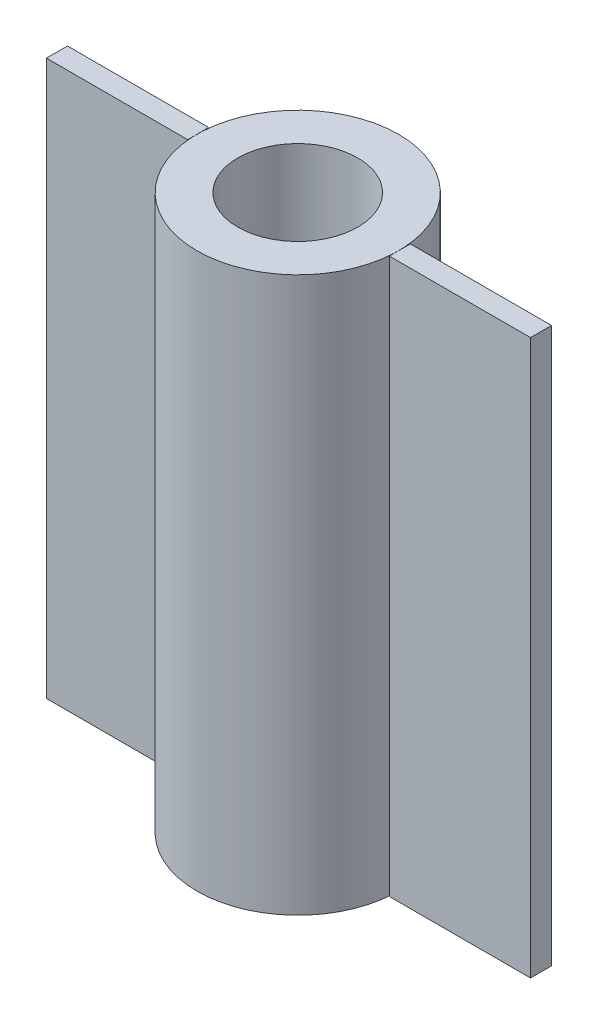
ISO-10303-21;
HEADER;
FILE_DESCRIPTION(('STEP AP214'),'2;1');
FILE_NAME('part.step','',(''),(''),'','','');
FILE_SCHEMA(('AUTOMOTIVE_DESIGN { 1 0 10303 214 1 1 1 1 }'));
ENDSEC;
DATA;
#1=APPLICATION_CONTEXT('core data for automotive mechanical design processes');
#2=APPLICATION_PROTOCOL_DEFINITION('international standard','automotive_design',2000,#1);
#3=PRODUCT_CONTEXT('',#1,'mechanical');
#4=PRODUCT('Part','Part','',(#3));
#5=PRODUCT_RELATED_PRODUCT_CATEGORY('part','',(#4));
#6=PRODUCT_DEFINITION_FORMATION('','',#4);
#7=PRODUCT_DEFINITION_CONTEXT('part definition',#1,'design');
#8=PRODUCT_DEFINITION('design','',#6,#7);
#9=PRODUCT_DEFINITION_SHAPE('','',#8);
#10=(LENGTH_UNIT() NAMED_UNIT(*) SI_UNIT(.MILLI.,.METRE.));
#11=(NAMED_UNIT(*) PLANE_ANGLE_UNIT() SI_UNIT($,.RADIAN.));
#12=(NAMED_UNIT(*) SI_UNIT($,.STERADIAN.) SOLID_ANGLE_UNIT());
#13=UNCERTAINTY_MEASURE_WITH_UNIT(LENGTH_MEASURE(1.E-05),#10,'distance_accuracy_value','');
#14=(GEOMETRIC_REPRESENTATION_CONTEXT(3) GLOBAL_UNCERTAINTY_ASSIGNED_CONTEXT((#13)) GLOBAL_UNIT_ASSIGNED_CONTEXT((#10,
#11,#12)) REPRESENTATION_CONTEXT('',''));
#15=CARTESIAN_POINT('',(0.,0.,0.));
#16=DIRECTION('',(0.,0.,1.));
#17=DIRECTION('',(1.,0.,0.));
#18=AXIS2_PLACEMENT_3D('',#15,#16,#17);
#19=CARTESIAN_POINT('',(-30.48,69.85,1.16507311882846));
#20=DIRECTION('',(0.,1.,0.));
#21=DIRECTION('',(0.,0.,1.));
#22=AXIS2_PLACEMENT_3D('',#19,#20,#21);
#23=PLANE('',#22);
#24=DIRECTION('',(0.,0.,-1.));
#25=VECTOR('',#24,1.);
#26=CARTESIAN_POINT('',(-12.7,69.85,1.16507311882846));
#27=LINE('',#26,#25);
#28=CARTESIAN_POINT('',(-12.7,69.85,1.16507311882846));
#29=VERTEX_POINT('',#28);
#30=CARTESIAN_POINT('',(-12.7,69.85,-1.48282033305441));
#31=VERTEX_POINT('',#30);
#32=EDGE_CURVE('E111',#29,#31,#27,.T.);
#33=ORIENTED_EDGE('',*,*,#32,.T.);
#34=DIRECTION('',(1.,0.,0.));
#35=VECTOR('',#34,1.);
#36=CARTESIAN_POINT('',(-30.48,69.85,-1.48282033305441));
#37=LINE('',#36,#35);
#38=CARTESIAN_POINT('',(-30.48,69.85,-1.48282033305441));
#39=VERTEX_POINT('',#38);
#40=EDGE_CURVE('E50',#39,#31,#37,.T.);
#41=ORIENTED_EDGE('',*,*,#40,.F.);
#42=DIRECTION('',(0.,0.,-1.));
#43=VECTOR('',#42,1.);
#44=CARTESIAN_POINT('',(-30.48,69.85,1.16507311882846));
#45=LINE('',#44,#43);
#46=CARTESIAN_POINT('',(-30.48,69.85,1.16507311882846));
#47=VERTEX_POINT('',#46);
#48=EDGE_CURVE('E100',#47,#39,#45,.T.);
#49=ORIENTED_EDGE('',*,*,#48,.F.);
#50=DIRECTION('',(1.,0.,0.));
#51=VECTOR('',#50,1.);
#52=CARTESIAN_POINT('',(-30.48,69.85,1.16507311882846));
#53=LINE('',#52,#51);
#54=EDGE_CURVE('E12',#47,#29,#53,.T.);
#55=ORIENTED_EDGE('',*,*,#54,.T.);
#56=EDGE_LOOP('',(#33,#41,#49,#55));
#57=FACE_BOUND('',#56,.T.);
#58=ADVANCED_FACE('F47',(#57),#23,.T.);
#59=CARTESIAN_POINT('',(-30.48,69.85,1.16507311882846));
#60=DIRECTION('',(0.,0.,-1.));
#61=DIRECTION('',(1.,0.,0.));
#62=AXIS2_PLACEMENT_3D('',#59,#60,#61);
#63=PLANE('',#62);
#64=DIRECTION('',(0.,-1.,0.));
#65=VECTOR('',#64,1.);
#66=CARTESIAN_POINT('',(-12.7,69.85,1.16507311882846));
#67=LINE('',#66,#65);
#68=CARTESIAN_POINT('',(-12.7,0.,1.16507311882846));
#69=VERTEX_POINT('',#68);
#70=EDGE_CURVE('E88',#29,#69,#67,.T.);
#71=ORIENTED_EDGE('',*,*,#70,.F.);
#72=ORIENTED_EDGE('',*,*,#54,.F.);
#73=DIRECTION('',(0.,-1.,0.));
#74=VECTOR('',#73,1.);
#75=CARTESIAN_POINT('',(-30.48,69.85,1.16507311882846));
#76=LINE('',#75,#74);
#77=CARTESIAN_POINT('',(-30.48,0.,1.16507311882846));
#78=VERTEX_POINT('',#77);
#79=EDGE_CURVE('E65',#47,#78,#76,.T.);
#80=ORIENTED_EDGE('',*,*,#79,.T.);
#81=DIRECTION('',(1.,0.,0.));
#82=VECTOR('',#81,1.);
#83=CARTESIAN_POINT('',(-30.48,0.,1.16507311882846));
#84=LINE('',#83,#82);
#85=EDGE_CURVE('E56',#78,#69,#84,.T.);
#86=ORIENTED_EDGE('',*,*,#85,.T.);
#87=EDGE_LOOP('',(#71,#72,#80,#86));
#88=FACE_BOUND('',#87,.T.);
#89=ADVANCED_FACE('F117',(#88),#63,.F.);
#90=CARTESIAN_POINT('',(-30.48,0.,1.16507311882846));
#91=DIRECTION('',(0.,1.,0.));
#92=DIRECTION('',(0.,0.,1.));
#93=AXIS2_PLACEMENT_3D('',#90,#91,#92);
#94=PLANE('',#93);
#95=DIRECTION('',(0.,0.,-1.));
#96=VECTOR('',#95,1.);
#97=CARTESIAN_POINT('',(-12.7,0.,1.16507311882846));
#98=LINE('',#97,#96);
#99=CARTESIAN_POINT('',(-12.7,0.,-1.48282033305441));
#100=VERTEX_POINT('',#99);
#101=EDGE_CURVE('E82',#69,#100,#98,.T.);
#102=ORIENTED_EDGE('',*,*,#101,.F.);
#103=ORIENTED_EDGE('',*,*,#85,.F.);
#104=DIRECTION('',(0.,0.,-1.));
#105=VECTOR('',#104,1.);
#106=CARTESIAN_POINT('',(-30.48,0.,1.16507311882846));
#107=LINE('',#106,#105);
#108=CARTESIAN_POINT('',(-30.48,0.,-1.48282033305441));
#109=VERTEX_POINT('',#108);
#110=EDGE_CURVE('E98',#78,#109,#107,.T.);
#111=ORIENTED_EDGE('',*,*,#110,.T.);
#112=DIRECTION('',(1.,0.,0.));
#113=VECTOR('',#112,1.);
#114=CARTESIAN_POINT('',(-30.48,0.,-1.48282033305441));
#115=LINE('',#114,#113);
#116=EDGE_CURVE('E103',#109,#100,#115,.T.);
#117=ORIENTED_EDGE('',*,*,#116,.T.);
#118=EDGE_LOOP('',(#102,#103,#111,#117));
#119=FACE_BOUND('',#118,.T.);
#120=ADVANCED_FACE('F106',(#119),#94,.F.);
#121=CARTESIAN_POINT('',(-30.48,69.85,-1.48282033305441));
#122=DIRECTION('',(0.,0.,-1.));
#123=DIRECTION('',(1.,0.,0.));
#124=AXIS2_PLACEMENT_3D('',#121,#122,#123);
#125=PLANE('',#124);
#126=DIRECTION('',(0.,-1.,0.));
#127=VECTOR('',#126,1.);
#128=CARTESIAN_POINT('',(-12.7,69.85,-1.48282033305441));
#129=LINE('',#128,#127);
#130=EDGE_CURVE('E105',#31,#100,#129,.T.);
#131=ORIENTED_EDGE('',*,*,#130,.T.);
#132=ORIENTED_EDGE('',*,*,#116,.F.);
#133=DIRECTION('',(0.,-1.,0.));
#134=VECTOR('',#133,1.);
#135=CARTESIAN_POINT('',(-30.48,69.85,-1.48282033305441));
#136=LINE('',#135,#134);
#137=EDGE_CURVE('E95',#39,#109,#136,.T.);
#138=ORIENTED_EDGE('',*,*,#137,.F.);
#139=ORIENTED_EDGE('',*,*,#40,.T.);
#140=EDGE_LOOP('',(#131,#132,#138,#139));
#141=FACE_BOUND('',#140,.T.);
#142=ADVANCED_FACE('F104',(#141),#125,.T.);
#143=CARTESIAN_POINT('',(-30.48,0.,0.));
#144=DIRECTION('',(1.,0.,0.));
#145=DIRECTION('',(0.,0.,1.));
#146=AXIS2_PLACEMENT_3D('',#143,#144,#145);
#147=PLANE('',#146);
#148=ORIENTED_EDGE('',*,*,#48,.T.);
#149=ORIENTED_EDGE('',*,*,#137,.T.);
#150=ORIENTED_EDGE('',*,*,#110,.F.);
#151=ORIENTED_EDGE('',*,*,#79,.F.);
#152=EDGE_LOOP('',(#148,#149,#150,#151));
#153=FACE_BOUND('',#152,.T.);
#154=ADVANCED_FACE('F96',(#153),#147,.F.);
#155=CARTESIAN_POINT('',(-12.7,0.,0.));
#156=DIRECTION('',(1.,0.,0.));
#157=DIRECTION('',(0.,0.,1.));
#158=AXIS2_PLACEMENT_3D('',#155,#156,#157);
#159=PLANE('',#158);
#160=ORIENTED_EDGE('',*,*,#32,.F.);
#161=ORIENTED_EDGE('',*,*,#70,.T.);
#162=ORIENTED_EDGE('',*,*,#101,.T.);
#163=ORIENTED_EDGE('',*,*,#130,.F.);
#164=EDGE_LOOP('',(#160,#161,#162,#163));
#165=FACE_BOUND('',#164,.T.);
#166=ADVANCED_FACE('F120',(#165),#159,.T.);
#167=CLOSED_SHELL('',(#58,#89,#120,#142,#154,#166));
#168=MANIFOLD_SOLID_BREP('B2',#167);
#169=CARTESIAN_POINT('',(30.48,69.85,1.16507311882846));
#170=DIRECTION('',(0.,1.,0.));
#171=DIRECTION('',(0.,0.,1.));
#172=AXIS2_PLACEMENT_3D('',#169,#170,#171);
#173=PLANE('',#172);
#174=DIRECTION('',(0.,0.,-1.));
#175=VECTOR('',#174,1.);
#176=CARTESIAN_POINT('',(12.7,69.85,1.16507311882846));
#177=LINE('',#176,#175);
#178=CARTESIAN_POINT('',(12.7,69.85,1.16507311882846));
#179=VERTEX_POINT('',#178);
#180=CARTESIAN_POINT('',(12.7,69.85,-1.48282033305441));
#181=VERTEX_POINT('',#180);
#182=EDGE_CURVE('E242',#179,#181,#177,.T.);
#183=ORIENTED_EDGE('',*,*,#182,.F.);
#184=DIRECTION('',(-1.,0.,0.));
#185=VECTOR('',#184,1.);
#186=CARTESIAN_POINT('',(30.48,69.85,1.16507311882846));
#187=LINE('',#186,#185);
#188=CARTESIAN_POINT('',(30.48,69.85,1.16507311882846));
#189=VERTEX_POINT('',#188);
#190=EDGE_CURVE('E45',#189,#179,#187,.T.);
#191=ORIENTED_EDGE('',*,*,#190,.F.);
#192=DIRECTION('',(0.,0.,-1.));
#193=VECTOR('',#192,1.);
#194=CARTESIAN_POINT('',(30.48,69.85,1.16507311882846));
#195=LINE('',#194,#193);
#196=CARTESIAN_POINT('',(30.48,69.85,-1.48282033305441));
#197=VERTEX_POINT('',#196);
#198=EDGE_CURVE('E237',#189,#197,#195,.T.);
#199=ORIENTED_EDGE('',*,*,#198,.T.);
#200=DIRECTION('',(-1.,0.,0.));
#201=VECTOR('',#200,1.);
#202=CARTESIAN_POINT('',(30.48,69.85,-1.48282033305441));
#203=LINE('',#202,#201);
#204=EDGE_CURVE('E180',#197,#181,#203,.T.);
#205=ORIENTED_EDGE('',*,*,#204,.T.);
#206=EDGE_LOOP('',(#183,#191,#199,#205));
#207=FACE_BOUND('',#206,.T.);
#208=ADVANCED_FACE('F177',(#207),#173,.T.);
#209=CARTESIAN_POINT('',(30.48,69.85,1.16507311882846));
#210=DIRECTION('',(0.,0.,-1.));
#211=DIRECTION('',(-1.,0.,0.));
#212=AXIS2_PLACEMENT_3D('',#209,#210,#211);
#213=PLANE('',#212);
#214=DIRECTION('',(0.,-1.,0.));
#215=VECTOR('',#214,1.);
#216=CARTESIAN_POINT('',(12.7,69.85,1.16507311882846));
#217=LINE('',#216,#215);
#218=CARTESIAN_POINT('',(12.7,0.,1.16507311882846));
#219=VERTEX_POINT('',#218);
#220=EDGE_CURVE('E210',#179,#219,#217,.T.);
#221=ORIENTED_EDGE('',*,*,#220,.T.);
#222=DIRECTION('',(-1.,0.,0.));
#223=VECTOR('',#222,1.);
#224=CARTESIAN_POINT('',(30.48,0.,1.16507311882846));
#225=LINE('',#224,#223);
#226=CARTESIAN_POINT('',(30.48,0.,1.16507311882846));
#227=VERTEX_POINT('',#226);
#228=EDGE_CURVE('E186',#227,#219,#225,.T.);
#229=ORIENTED_EDGE('',*,*,#228,.F.);
#230=DIRECTION('',(0.,-1.,0.));
#231=VECTOR('',#230,1.);
#232=CARTESIAN_POINT('',(30.48,69.85,1.16507311882846));
#233=LINE('',#232,#231);
#234=EDGE_CURVE('E227',#189,#227,#233,.T.);
#235=ORIENTED_EDGE('',*,*,#234,.F.);
#236=ORIENTED_EDGE('',*,*,#190,.T.);
#237=EDGE_LOOP('',(#221,#229,#235,#236));
#238=FACE_BOUND('',#237,.T.);
#239=ADVANCED_FACE('F252',(#238),#213,.F.);
#240=CARTESIAN_POINT('',(30.48,0.,1.16507311882846));
#241=DIRECTION('',(0.,1.,0.));
#242=DIRECTION('',(0.,0.,1.));
#243=AXIS2_PLACEMENT_3D('',#240,#241,#242);
#244=PLANE('',#243);
#245=DIRECTION('',(0.,0.,-1.));
#246=VECTOR('',#245,1.);
#247=CARTESIAN_POINT('',(12.7,0.,1.16507311882846));
#248=LINE('',#247,#246);
#249=CARTESIAN_POINT('',(12.7,0.,-1.48282033305441));
#250=VERTEX_POINT('',#249);
#251=EDGE_CURVE('E234',#219,#250,#248,.T.);
#252=ORIENTED_EDGE('',*,*,#251,.T.);
#253=DIRECTION('',(-1.,0.,0.));
#254=VECTOR('',#253,1.);
#255=CARTESIAN_POINT('',(30.48,0.,-1.48282033305441));
#256=LINE('',#255,#254);
#257=CARTESIAN_POINT('',(30.48,0.,-1.48282033305441));
#258=VERTEX_POINT('',#257);
#259=EDGE_CURVE('E231',#258,#250,#256,.T.);
#260=ORIENTED_EDGE('',*,*,#259,.F.);
#261=DIRECTION('',(0.,0.,-1.));
#262=VECTOR('',#261,1.);
#263=CARTESIAN_POINT('',(30.48,0.,1.16507311882846));
#264=LINE('',#263,#262);
#265=EDGE_CURVE('E222',#227,#258,#264,.T.);
#266=ORIENTED_EDGE('',*,*,#265,.F.);
#267=ORIENTED_EDGE('',*,*,#228,.T.);
#268=EDGE_LOOP('',(#252,#260,#266,#267));
#269=FACE_BOUND('',#268,.T.);
#270=ADVANCED_FACE('F232',(#269),#244,.F.);
#271=CARTESIAN_POINT('',(30.48,69.85,-1.48282033305441));
#272=DIRECTION('',(0.,0.,-1.));
#273=DIRECTION('',(-1.,0.,0.));
#274=AXIS2_PLACEMENT_3D('',#271,#272,#273);
#275=PLANE('',#274);
#276=DIRECTION('',(0.,-1.,0.));
#277=VECTOR('',#276,1.);
#278=CARTESIAN_POINT('',(12.7,69.85,-1.48282033305441));
#279=LINE('',#278,#277);
#280=EDGE_CURVE('E245',#181,#250,#279,.T.);
#281=ORIENTED_EDGE('',*,*,#280,.F.);
#282=ORIENTED_EDGE('',*,*,#204,.F.);
#283=DIRECTION('',(0.,-1.,0.));
#284=VECTOR('',#283,1.);
#285=CARTESIAN_POINT('',(30.48,69.85,-1.48282033305441));
#286=LINE('',#285,#284);
#287=EDGE_CURVE('E226',#197,#258,#286,.T.);
#288=ORIENTED_EDGE('',*,*,#287,.T.);
#289=ORIENTED_EDGE('',*,*,#259,.T.);
#290=EDGE_LOOP('',(#281,#282,#288,#289));
#291=FACE_BOUND('',#290,.T.);
#292=ADVANCED_FACE('F236',(#291),#275,.T.);
#293=CARTESIAN_POINT('',(30.48,0.,0.));
#294=DIRECTION('',(-1.,0.,0.));
#295=DIRECTION('',(0.,0.,1.));
#296=AXIS2_PLACEMENT_3D('',#293,#294,#295);
#297=PLANE('',#296);
#298=ORIENTED_EDGE('',*,*,#198,.F.);
#299=ORIENTED_EDGE('',*,*,#234,.T.);
#300=ORIENTED_EDGE('',*,*,#265,.T.);
#301=ORIENTED_EDGE('',*,*,#287,.F.);
#302=EDGE_LOOP('',(#298,#299,#300,#301));
#303=FACE_BOUND('',#302,.T.);
#304=ADVANCED_FACE('F225',(#303),#297,.F.);
#305=CARTESIAN_POINT('',(12.7,0.,0.));
#306=DIRECTION('',(-1.,0.,0.));
#307=DIRECTION('',(0.,0.,1.));
#308=AXIS2_PLACEMENT_3D('',#305,#306,#307);
#309=PLANE('',#308);
#310=ORIENTED_EDGE('',*,*,#182,.T.);
#311=ORIENTED_EDGE('',*,*,#280,.T.);
#312=ORIENTED_EDGE('',*,*,#251,.F.);
#313=ORIENTED_EDGE('',*,*,#220,.F.);
#314=EDGE_LOOP('',(#310,#311,#312,#313));
#315=FACE_BOUND('',#314,.T.);
#316=ADVANCED_FACE('F250',(#315),#309,.T.);
#317=CLOSED_SHELL('',(#208,#239,#270,#292,#304,#316));
#318=MANIFOLD_SOLID_BREP('B6',#317);
#319=CARTESIAN_POINT('',(0.,69.85,0.));
#320=DIRECTION('',(0.,-1.,0.));
#321=DIRECTION('',(0.,0.,-1.));
#322=AXIS2_PLACEMENT_3D('',#319,#320,#321);
#323=CYLINDRICAL_SURFACE('',#322,12.7);
#324=CARTESIAN_POINT('',(0.,69.85,0.));
#325=DIRECTION('',(0.,1.,0.));
#326=DIRECTION('',(0.,0.,1.));
#327=AXIS2_PLACEMENT_3D('',#324,#325,#326);
#328=CIRCLE('',#327,12.7);
#329=CARTESIAN_POINT('',(0.,69.85,12.7));
#330=VERTEX_POINT('',#329);
#331=EDGE_CURVE('E176',#330,#330,#328,.T.);
#332=ORIENTED_EDGE('',*,*,#331,.F.);
#333=EDGE_LOOP('',(#332));
#334=FACE_BOUND('',#333,.T.);
#335=CARTESIAN_POINT('',(0.,0.,0.));
#336=DIRECTION('',(0.,1.,0.));
#337=DIRECTION('',(0.,0.,1.));
#338=AXIS2_PLACEMENT_3D('',#335,#336,#337);
#339=CIRCLE('',#338,12.7);
#340=CARTESIAN_POINT('',(0.,0.,12.7));
#341=VERTEX_POINT('',#340);
#342=EDGE_CURVE('E303',#341,#341,#339,.T.);
#343=ORIENTED_EDGE('',*,*,#342,.T.);
#344=EDGE_LOOP('',(#343));
#345=FACE_BOUND('',#344,.T.);
#346=ADVANCED_FACE('F300',(#334,#345),#323,.T.);
#347=CARTESIAN_POINT('',(0.,69.85,0.));
#348=DIRECTION('',(0.,1.,0.));
#349=DIRECTION('',(0.,0.,1.));
#350=AXIS2_PLACEMENT_3D('',#347,#348,#349);
#351=PLANE('',#350);
#352=CARTESIAN_POINT('',(0.,69.85,0.));
#353=DIRECTION('',(0.,1.,0.));
#354=DIRECTION('',(0.,0.,1.));
#355=AXIS2_PLACEMENT_3D('',#352,#353,#354);
#356=CIRCLE('',#355,7.55737300412684);
#357=CARTESIAN_POINT('',(0.,69.85,7.55737300412684));
#358=VERTEX_POINT('',#357);
#359=EDGE_CURVE('E312',#358,#358,#356,.T.);
#360=ORIENTED_EDGE('',*,*,#359,.F.);
#361=EDGE_LOOP('',(#360));
#362=FACE_BOUND('',#361,.T.);
#363=ORIENTED_EDGE('',*,*,#331,.T.);
#364=EDGE_LOOP('',(#363));
#365=FACE_BOUND('',#364,.T.);
#366=ADVANCED_FACE('F327',(#362,#365),#351,.T.);
#367=CARTESIAN_POINT('',(0.,0.,0.));
#368=DIRECTION('',(0.,1.,0.));
#369=DIRECTION('',(0.,0.,1.));
#370=AXIS2_PLACEMENT_3D('',#367,#368,#369);
#371=PLANE('',#370);
#372=ORIENTED_EDGE('',*,*,#342,.F.);
#373=EDGE_LOOP('',(#372));
#374=FACE_BOUND('',#373,.T.);
#375=ADVANCED_FACE('F323',(#374),#371,.F.);
#376=CARTESIAN_POINT('',(0.,8.89,0.));
#377=DIRECTION('',(0.,1.,0.));
#378=DIRECTION('',(0.,0.,1.));
#379=AXIS2_PLACEMENT_3D('',#376,#377,#378);
#380=CYLINDRICAL_SURFACE('',#379,7.55737300412684);
#381=CARTESIAN_POINT('',(0.,8.89,0.));
#382=DIRECTION('',(0.,1.,0.));
#383=DIRECTION('',(0.,0.,1.));
#384=AXIS2_PLACEMENT_3D('',#381,#382,#383);
#385=CIRCLE('',#384,7.55737300412684);
#386=CARTESIAN_POINT('',(0.,8.89,7.55737300412684));
#387=VERTEX_POINT('',#386);
#388=EDGE_CURVE('E310',#387,#387,#385,.T.);
#389=CARTESIAN_POINT('',(0.,8.89,7.55737300412684));
#390=CARTESIAN_POINT('',(0.,9.525,7.55737300412684));
#391=CARTESIAN_POINT('',(0.,10.16,7.55737300412684));
#392=CARTESIAN_POINT('',(0.,11.43,7.55737300412684));
#393=CARTESIAN_POINT('',(0.,12.065,7.55737300412684));
#394=CARTESIAN_POINT('',(0.,13.335,7.55737300412684));
#395=CARTESIAN_POINT('',(0.,13.97,7.55737300412684));
#396=CARTESIAN_POINT('',(0.,15.24,7.55737300412684));
#397=CARTESIAN_POINT('',(0.,15.875,7.55737300412684));
#398=CARTESIAN_POINT('',(0.,17.145,7.55737300412684));
#399=CARTESIAN_POINT('',(0.,17.78,7.55737300412684));
#400=CARTESIAN_POINT('',(0.,19.05,7.55737300412684));
#401=CARTESIAN_POINT('',(0.,19.685,7.55737300412684));
#402=CARTESIAN_POINT('',(0.,20.955,7.55737300412684));
#403=CARTESIAN_POINT('',(0.,21.59,7.55737300412684));
#404=CARTESIAN_POINT('',(0.,22.86,7.55737300412684));
#405=CARTESIAN_POINT('',(0.,23.495,7.55737300412684));
#406=CARTESIAN_POINT('',(0.,24.765,7.55737300412684));
#407=CARTESIAN_POINT('',(0.,25.4,7.55737300412684));
#408=CARTESIAN_POINT('',(0.,26.67,7.55737300412684));
#409=CARTESIAN_POINT('',(0.,27.305,7.55737300412684));
#410=CARTESIAN_POINT('',(0.,28.575,7.55737300412684));
#411=CARTESIAN_POINT('',(0.,29.21,7.55737300412684));
#412=CARTESIAN_POINT('',(0.,30.48,7.55737300412684));
#413=CARTESIAN_POINT('',(0.,31.115,7.55737300412684));
#414=CARTESIAN_POINT('',(0.,32.385,7.55737300412684));
#415=CARTESIAN_POINT('',(0.,33.02,7.55737300412684));
#416=CARTESIAN_POINT('',(0.,34.29,7.55737300412684));
#417=CARTESIAN_POINT('',(0.,34.925,7.55737300412684));
#418=CARTESIAN_POINT('',(0.,36.195,7.55737300412684));
#419=CARTESIAN_POINT('',(0.,36.83,7.55737300412684));
#420=CARTESIAN_POINT('',(0.,38.1,7.55737300412684));
#421=CARTESIAN_POINT('',(0.,38.735,7.55737300412684));
#422=CARTESIAN_POINT('',(0.,40.005,7.55737300412684));
#423=CARTESIAN_POINT('',(0.,40.64,7.55737300412684));
#424=CARTESIAN_POINT('',(0.,41.91,7.55737300412684));
#425=CARTESIAN_POINT('',(0.,42.545,7.55737300412684));
#426=CARTESIAN_POINT('',(0.,43.815,7.55737300412684));
#427=CARTESIAN_POINT('',(0.,44.45,7.55737300412684));
#428=CARTESIAN_POINT('',(0.,45.72,7.55737300412684));
#429=CARTESIAN_POINT('',(0.,46.355,7.55737300412684));
#430=CARTESIAN_POINT('',(0.,47.625,7.55737300412684));
#431=CARTESIAN_POINT('',(0.,48.26,7.55737300412684));
#432=CARTESIAN_POINT('',(0.,49.53,7.55737300412684));
#433=CARTESIAN_POINT('',(0.,50.165,7.55737300412684));
#434=CARTESIAN_POINT('',(0.,51.435,7.55737300412684));
#435=CARTESIAN_POINT('',(0.,52.07,7.55737300412684));
#436=CARTESIAN_POINT('',(0.,53.34,7.55737300412684));
#437=CARTESIAN_POINT('',(0.,53.975,7.55737300412684));
#438=CARTESIAN_POINT('',(0.,55.245,7.55737300412684));
#439=CARTESIAN_POINT('',(0.,55.88,7.55737300412684));
#440=CARTESIAN_POINT('',(0.,57.15,7.55737300412684));
#441=CARTESIAN_POINT('',(0.,57.785,7.55737300412684));
#442=CARTESIAN_POINT('',(0.,59.055,7.55737300412684));
#443=CARTESIAN_POINT('',(0.,59.69,7.55737300412684));
#444=CARTESIAN_POINT('',(0.,60.96,7.55737300412684));
#445=CARTESIAN_POINT('',(0.,61.595,7.55737300412684));
#446=CARTESIAN_POINT('',(0.,62.865,7.55737300412684));
#447=CARTESIAN_POINT('',(0.,63.5,7.55737300412684));
#448=CARTESIAN_POINT('',(0.,64.77,7.55737300412684));
#449=CARTESIAN_POINT('',(0.,65.405,7.55737300412684));
#450=CARTESIAN_POINT('',(0.,66.675,7.55737300412684));
#451=CARTESIAN_POINT('',(0.,67.31,7.55737300412684));
#452=CARTESIAN_POINT('',(0.,68.58,7.55737300412684));
#453=CARTESIAN_POINT('',(0.,69.215,7.55737300412684));
#454=CARTESIAN_POINT('',(0.,69.85,7.55737300412684));
#455=B_SPLINE_CURVE_WITH_KNOTS('',3,(#389,#390,#391,#392,#393,#394,#395,#396,#397,#398,#399,
#400,#401,#402,#403,#404,#405,#406,#407,#408,#409,#410,#411,#412,#413,#414,#415,#416,#417,#418,
#419,#420,#421,#422,#423,#424,#425,#426,#427,#428,#429,#430,#431,#432,#433,#434,#435,#436,#437,
#438,#439,#440,#441,#442,#443,#444,#445,#446,#447,#448,#449,#450,#451,#452,#453,#454),
.UNSPECIFIED.,.F.,.F.,(4,2,2,2,2,2,2,2,2,2,2,2,2,2,2,2,2,2,2,2,2,2,2,2,2,2,2,2,2,2,2,2,4),(0.,
1.905,3.81,5.715,7.62,9.525,11.43,13.335,15.24,17.145,19.05,20.955,22.86,24.765,26.67,28.575,
30.48,32.385,34.29,36.195,38.1,40.005,41.91,43.815,45.72,47.625,49.53,51.435,53.34,55.245,57.15,
59.055,60.96),.UNSPECIFIED.);
#456=EDGE_CURVE('BSEAM320',#387,#358,#455,.T.);
#457=ORIENTED_EDGE('',*,*,#388,.F.);
#458=ORIENTED_EDGE('',*,*,#359,.T.);
#459=ORIENTED_EDGE('',*,*,#456,.T.);
#460=ORIENTED_EDGE('',*,*,#456,.F.);
#461=EDGE_LOOP('',(#457,#459,#458,#460));
#462=FACE_BOUND('',#461,.T.);
#463=ADVANCED_FACE('F320',(#462),#380,.F.);
#464=CARTESIAN_POINT('',(0.,8.89,0.));
#465=DIRECTION('',(0.,1.,0.));
#466=DIRECTION('',(0.,0.,1.));
#467=AXIS2_PLACEMENT_3D('',#464,#465,#466);
#468=PLANE('',#467);
#469=ORIENTED_EDGE('',*,*,#388,.T.);
#470=EDGE_LOOP('',(#469));
#471=FACE_BOUND('',#470,.T.);
#472=ADVANCED_FACE('F318',(#471),#468,.T.);
#473=CLOSED_SHELL('',(#346,#366,#375,#463,#472));
#474=MANIFOLD_SOLID_BREP('B39',#473);
#475=ADVANCED_BREP_SHAPE_REPRESENTATION('',(#18,#168,#318,#474),#14);
#476=SHAPE_DEFINITION_REPRESENTATION(#9,#475);
ENDSEC;
END-ISO-10303-21;
